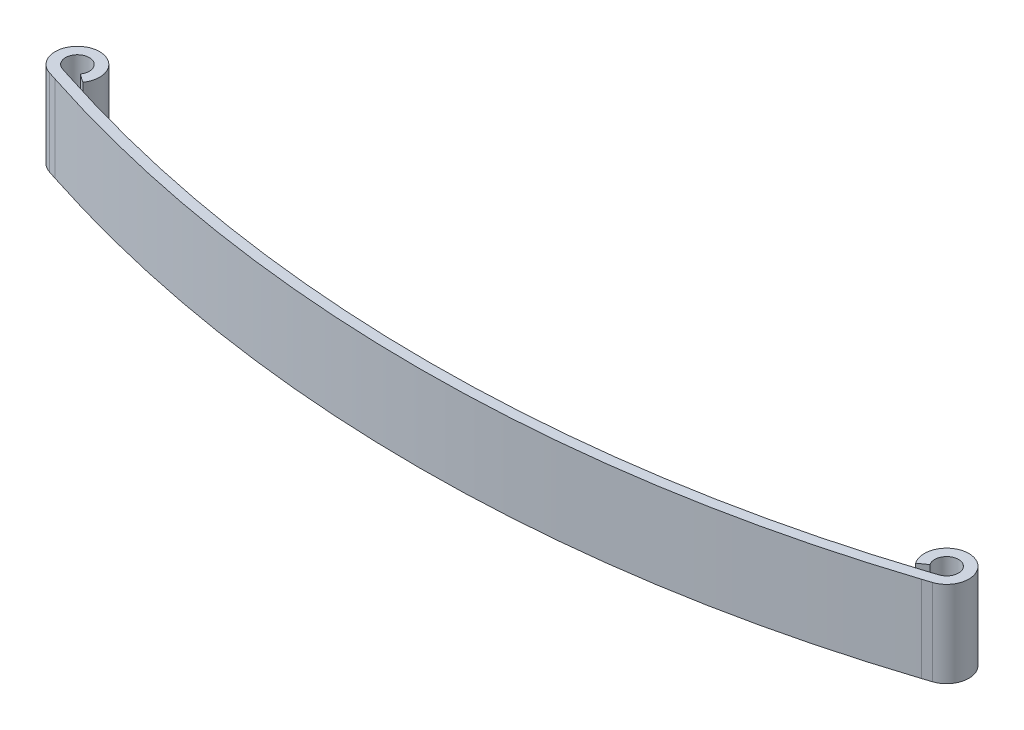
ISO-10303-21;
HEADER;
FILE_DESCRIPTION(('STEP AP214'),'2;1');
FILE_NAME('part.step','',(''),(''),'','','');
FILE_SCHEMA(('AUTOMOTIVE_DESIGN { 1 0 10303 214 1 1 1 1 }'));
ENDSEC;
DATA;
#1=APPLICATION_CONTEXT('core data for automotive mechanical design processes');
#2=APPLICATION_PROTOCOL_DEFINITION('international standard','automotive_design',2000,#1);
#3=PRODUCT_CONTEXT('',#1,'mechanical');
#4=PRODUCT('Part','Part','',(#3));
#5=PRODUCT_RELATED_PRODUCT_CATEGORY('part','',(#4));
#6=PRODUCT_DEFINITION_FORMATION('','',#4);
#7=PRODUCT_DEFINITION_CONTEXT('part definition',#1,'design');
#8=PRODUCT_DEFINITION('design','',#6,#7);
#9=PRODUCT_DEFINITION_SHAPE('','',#8);
#10=(LENGTH_UNIT() NAMED_UNIT(*) SI_UNIT(.MILLI.,.METRE.));
#11=(NAMED_UNIT(*) PLANE_ANGLE_UNIT() SI_UNIT($,.RADIAN.));
#12=(NAMED_UNIT(*) SI_UNIT($,.STERADIAN.) SOLID_ANGLE_UNIT());
#13=UNCERTAINTY_MEASURE_WITH_UNIT(LENGTH_MEASURE(1.E-05),#10,'distance_accuracy_value','');
#14=(GEOMETRIC_REPRESENTATION_CONTEXT(3) GLOBAL_UNCERTAINTY_ASSIGNED_CONTEXT((#13)) GLOBAL_UNIT_ASSIGNED_CONTEXT((#10,
#11,#12)) REPRESENTATION_CONTEXT('',''));
#15=CARTESIAN_POINT('',(0.,0.,0.));
#16=DIRECTION('',(0.,0.,1.));
#17=DIRECTION('',(1.,0.,0.));
#18=AXIS2_PLACEMENT_3D('',#15,#16,#17);
#19=CARTESIAN_POINT('',(221.456257489738,100.,0.));
#20=DIRECTION('',(0.,-1.,0.));
#21=DIRECTION('',(0.,0.,-1.));
#22=AXIS2_PLACEMENT_3D('',#19,#20,#21);
#23=CYLINDRICAL_SURFACE('',#22,1618.48721605359);
#24=CARTESIAN_POINT('',(221.456257489738,0.,0.));
#25=DIRECTION('',(0.,-1.,0.));
#26=DIRECTION('',(0.,0.,1.));
#27=AXIS2_PLACEMENT_3D('',#24,#25,#26);
#28=CIRCLE('',#27,1618.48721605359);
#29=CARTESIAN_POINT('',(721.456257489126,0.,1539.31831293255));
#30=VERTEX_POINT('',#29);
#31=CARTESIAN_POINT('',(-278.54374250966,0.,1539.31831293255));
#32=VERTEX_POINT('',#31);
#33=EDGE_CURVE('E152',#30,#32,#28,.T.);
#34=ORIENTED_EDGE('',*,*,#33,.T.);
#35=DIRECTION('',(0.,-1.,0.));
#36=VECTOR('',#35,1.);
#37=CARTESIAN_POINT('',(-278.54374250966,100.,1539.31831293255));
#38=LINE('',#37,#36);
#39=CARTESIAN_POINT('',(-278.54374250966,100.,1539.31831293255));
#40=VERTEX_POINT('',#39);
#41=EDGE_CURVE('E11',#40,#32,#38,.T.);
#42=ORIENTED_EDGE('',*,*,#41,.F.);
#43=CARTESIAN_POINT('',(221.456257489738,100.,0.));
#44=DIRECTION('',(0.,-1.,0.));
#45=DIRECTION('',(0.,0.,1.));
#46=AXIS2_PLACEMENT_3D('',#43,#44,#45);
#47=CIRCLE('',#46,1618.48721605359);
#48=CARTESIAN_POINT('',(721.456257489126,100.,1539.31831293255));
#49=VERTEX_POINT('',#48);
#50=EDGE_CURVE('E174',#49,#40,#47,.T.);
#51=ORIENTED_EDGE('',*,*,#50,.F.);
#52=DIRECTION('',(0.,-1.,0.));
#53=VECTOR('',#52,1.);
#54=CARTESIAN_POINT('',(721.456257489126,100.,1539.31831293255));
#55=LINE('',#54,#53);
#56=EDGE_CURVE('E148',#49,#30,#55,.T.);
#57=ORIENTED_EDGE('',*,*,#56,.T.);
#58=EDGE_LOOP('',(#34,#42,#51,#57));
#59=FACE_BOUND('',#58,.T.);
#60=ADVANCED_FACE('F32',(#59),#23,.F.);
#61=CARTESIAN_POINT('',(-278.54374250966,100.,1539.31831293255));
#62=DIRECTION('',(-0.308930459900999,0.,0.951084628697866));
#63=DIRECTION('',(0.951084628697866,0.,0.308930459900999));
#64=AXIS2_PLACEMENT_3D('',#61,#62,#63);
#65=PLANE('',#64);
#66=DIRECTION('',(-0.951084628697866,0.,-0.308930459900999));
#67=VECTOR('',#66,1.);
#68=CARTESIAN_POINT('',(-278.54374250966,0.,1539.31831293255));
#69=LINE('',#68,#67);
#70=CARTESIAN_POINT('',(-288.054588797212,0.,1536.22900833335));
#71=VERTEX_POINT('',#70);
#72=EDGE_CURVE('E155',#32,#71,#69,.T.);
#73=ORIENTED_EDGE('',*,*,#72,.T.);
#74=DIRECTION('',(0.,-1.,0.));
#75=VECTOR('',#74,1.);
#76=CARTESIAN_POINT('',(-288.054588797212,100.,1536.22900833335));
#77=LINE('',#76,#75);
#78=CARTESIAN_POINT('',(-288.054588797212,100.,1536.22900833335));
#79=VERTEX_POINT('',#78);
#80=EDGE_CURVE('E40',#79,#71,#77,.T.);
#81=ORIENTED_EDGE('',*,*,#80,.F.);
#82=DIRECTION('',(-0.951084628697866,0.,-0.308930459900999));
#83=VECTOR('',#82,1.);
#84=CARTESIAN_POINT('',(-278.54374250966,100.,1539.31831293255));
#85=LINE('',#84,#83);
#86=EDGE_CURVE('E103',#40,#79,#85,.T.);
#87=ORIENTED_EDGE('',*,*,#86,.F.);
#88=ORIENTED_EDGE('',*,*,#41,.T.);
#89=EDGE_LOOP('',(#73,#81,#87,#88));
#90=FACE_BOUND('',#89,.T.);
#91=ADVANCED_FACE('F252',(#90),#65,.F.);
#92=CARTESIAN_POINT('',(-283.784944200392,100.,1523.08432409909));
#93=DIRECTION('',(0.,-1.,0.));
#94=DIRECTION('',(0.,0.,-1.));
#95=AXIS2_PLACEMENT_3D('',#92,#93,#94);
#96=CYLINDRICAL_SURFACE('',#95,13.8207303932043);
#97=CARTESIAN_POINT('',(-283.784944200392,0.,1523.08432409909));
#98=DIRECTION('',(0.,-1.,0.));
#99=DIRECTION('',(0.,0.,-1.));
#100=AXIS2_PLACEMENT_3D('',#97,#98,#99);
#101=CIRCLE('',#100,13.8207303932043);
#102=CARTESIAN_POINT('',(-272.487055111111,0.,1531.04486998036));
#103=VERTEX_POINT('',#102);
#104=EDGE_CURVE('E157',#71,#103,#101,.T.);
#105=ORIENTED_EDGE('',*,*,#104,.T.);
#106=DIRECTION('',(0.,-1.,0.));
#107=VECTOR('',#106,1.);
#108=CARTESIAN_POINT('',(-272.487055111111,100.,1531.04486998036));
#109=LINE('',#108,#107);
#110=CARTESIAN_POINT('',(-272.487055111111,100.,1531.04486998036));
#111=VERTEX_POINT('',#110);
#112=EDGE_CURVE('E193',#111,#103,#109,.T.);
#113=ORIENTED_EDGE('',*,*,#112,.F.);
#114=CARTESIAN_POINT('',(-283.784944200392,100.,1523.08432409909));
#115=DIRECTION('',(0.,-1.,0.));
#116=DIRECTION('',(0.,0.,-1.));
#117=AXIS2_PLACEMENT_3D('',#114,#115,#116);
#118=CIRCLE('',#117,13.8207303932043);
#119=EDGE_CURVE('E201',#79,#111,#118,.T.);
#120=ORIENTED_EDGE('',*,*,#119,.F.);
#121=ORIENTED_EDGE('',*,*,#80,.T.);
#122=EDGE_LOOP('',(#105,#113,#120,#121));
#123=FACE_BOUND('',#122,.T.);
#124=ADVANCED_FACE('F199',(#123),#96,.F.);
#125=CARTESIAN_POINT('',(-272.487055111111,100.,1531.04486998036));
#126=DIRECTION('',(0.575985903407235,0.,-0.817459625349259));
#127=DIRECTION('',(-0.817459625349259,0.,-0.575985903407235));
#128=AXIS2_PLACEMENT_3D('',#125,#126,#127);
#129=PLANE('',#128);
#130=DIRECTION('',(0.817459625349259,0.,0.575985903407235));
#131=VECTOR('',#130,1.);
#132=CARTESIAN_POINT('',(-272.487055111111,0.,1531.04486998036));
#133=LINE('',#132,#131);
#134=CARTESIAN_POINT('',(-262.677539606919,0.,1537.95670082125));
#135=VERTEX_POINT('',#134);
#136=EDGE_CURVE('E159',#103,#135,#133,.T.);
#137=ORIENTED_EDGE('',*,*,#136,.T.);
#138=DIRECTION('',(0.,-1.,0.));
#139=VECTOR('',#138,1.);
#140=CARTESIAN_POINT('',(-262.677539606919,100.,1537.95670082125));
#141=LINE('',#140,#139);
#142=CARTESIAN_POINT('',(-262.677539606919,100.,1537.95670082125));
#143=VERTEX_POINT('',#142);
#144=EDGE_CURVE('E190',#143,#135,#141,.T.);
#145=ORIENTED_EDGE('',*,*,#144,.F.);
#146=DIRECTION('',(0.817459625349259,0.,0.575985903407235));
#147=VECTOR('',#146,1.);
#148=CARTESIAN_POINT('',(-272.487055111111,100.,1531.04486998036));
#149=LINE('',#148,#147);
#150=EDGE_CURVE('E219',#111,#143,#149,.T.);
#151=ORIENTED_EDGE('',*,*,#150,.F.);
#152=ORIENTED_EDGE('',*,*,#112,.T.);
#153=EDGE_LOOP('',(#137,#145,#151,#152));
#154=FACE_BOUND('',#153,.T.);
#155=ADVANCED_FACE('F210',(#154),#129,.F.);
#156=CARTESIAN_POINT('',(-283.784944200392,100.,1523.08432409909));
#157=DIRECTION('',(0.,-1.,0.));
#158=DIRECTION('',(0.,0.,-1.));
#159=AXIS2_PLACEMENT_3D('',#156,#157,#158);
#160=CYLINDRICAL_SURFACE('',#159,25.8207303932044);
#161=CARTESIAN_POINT('',(-283.784944200392,0.,1523.08432409909));
#162=DIRECTION('',(0.,1.,0.));
#163=DIRECTION('',(0.,0.,-1.));
#164=AXIS2_PLACEMENT_3D('',#161,#162,#163);
#165=CIRCLE('',#164,25.8207303932044);
#166=CARTESIAN_POINT('',(-291.761754316031,0.,1547.64202387772));
#167=VERTEX_POINT('',#166);
#168=EDGE_CURVE('E161',#135,#167,#165,.T.);
#169=ORIENTED_EDGE('',*,*,#168,.T.);
#170=DIRECTION('',(0.,-1.,0.));
#171=VECTOR('',#170,1.);
#172=CARTESIAN_POINT('',(-291.761754316031,100.,1547.64202387772));
#173=LINE('',#172,#171);
#174=CARTESIAN_POINT('',(-291.761754316031,100.,1547.64202387772));
#175=VERTEX_POINT('',#174);
#176=EDGE_CURVE('E187',#175,#167,#173,.T.);
#177=ORIENTED_EDGE('',*,*,#176,.F.);
#178=CARTESIAN_POINT('',(-283.784944200392,100.,1523.08432409909));
#179=DIRECTION('',(0.,1.,0.));
#180=DIRECTION('',(0.,0.,-1.));
#181=AXIS2_PLACEMENT_3D('',#178,#179,#180);
#182=CIRCLE('',#181,25.8207303932044);
#183=EDGE_CURVE('E216',#143,#175,#182,.T.);
#184=ORIENTED_EDGE('',*,*,#183,.F.);
#185=ORIENTED_EDGE('',*,*,#144,.T.);
#186=EDGE_LOOP('',(#169,#177,#184,#185));
#187=FACE_BOUND('',#186,.T.);
#188=ADVANCED_FACE('F214',(#187),#160,.T.);
#189=CARTESIAN_POINT('',(-282.250908028406,100.,1550.73132847694));
#190=DIRECTION('',(0.30893045990107,0.,-0.951084628697842));
#191=DIRECTION('',(-0.951084628697843,0.,-0.30893045990107));
#192=AXIS2_PLACEMENT_3D('',#189,#190,#191);
#193=PLANE('',#192);
#194=DIRECTION('',(0.951084628697842,0.,0.30893045990107));
#195=VECTOR('',#194,1.);
#196=CARTESIAN_POINT('',(-282.250908028406,0.,1550.73132847694));
#197=LINE('',#196,#195);
#198=CARTESIAN_POINT('',(-282.250908028406,0.,1550.73132847694));
#199=VERTEX_POINT('',#198);
#200=EDGE_CURVE('E163',#167,#199,#197,.T.);
#201=ORIENTED_EDGE('',*,*,#200,.T.);
#202=DIRECTION('',(0.,-1.,0.));
#203=VECTOR('',#202,1.);
#204=CARTESIAN_POINT('',(-282.250908028406,100.,1550.73132847694));
#205=LINE('',#204,#203);
#206=CARTESIAN_POINT('',(-282.250908028406,100.,1550.73132847694));
#207=VERTEX_POINT('',#206);
#208=EDGE_CURVE('E184',#207,#199,#205,.T.);
#209=ORIENTED_EDGE('',*,*,#208,.F.);
#210=DIRECTION('',(0.951084628697842,0.,0.30893045990107));
#211=VECTOR('',#210,1.);
#212=CARTESIAN_POINT('',(-282.250908028406,100.,1550.73132847694));
#213=LINE('',#212,#211);
#214=EDGE_CURVE('E218',#175,#207,#213,.T.);
#215=ORIENTED_EDGE('',*,*,#214,.F.);
#216=ORIENTED_EDGE('',*,*,#176,.T.);
#217=EDGE_LOOP('',(#201,#209,#215,#216));
#218=FACE_BOUND('',#217,.T.);
#219=ADVANCED_FACE('F265',(#218),#193,.F.);
#220=CARTESIAN_POINT('',(221.456257489738,100.,0.));
#221=DIRECTION('',(0.,-1.,0.));
#222=DIRECTION('',(0.,0.,-1.));
#223=AXIS2_PLACEMENT_3D('',#220,#221,#222);
#224=CYLINDRICAL_SURFACE('',#223,1630.48721605359);
#225=CARTESIAN_POINT('',(221.456257489738,0.,0.));
#226=DIRECTION('',(0.,1.,0.));
#227=DIRECTION('',(0.,0.,1.));
#228=AXIS2_PLACEMENT_3D('',#225,#226,#227);
#229=CIRCLE('',#228,1630.48721605359);
#230=CARTESIAN_POINT('',(725.163423007932,0.,1550.73132847693));
#231=VERTEX_POINT('',#230);
#232=EDGE_CURVE('E165',#199,#231,#229,.T.);
#233=ORIENTED_EDGE('',*,*,#232,.T.);
#234=DIRECTION('',(0.,-1.,0.));
#235=VECTOR('',#234,1.);
#236=CARTESIAN_POINT('',(725.163423007932,100.,1550.73132847693));
#237=LINE('',#236,#235);
#238=CARTESIAN_POINT('',(725.163423007932,100.,1550.73132847693));
#239=VERTEX_POINT('',#238);
#240=EDGE_CURVE('E181',#239,#231,#237,.T.);
#241=ORIENTED_EDGE('',*,*,#240,.F.);
#242=CARTESIAN_POINT('',(221.456257489738,100.,0.));
#243=DIRECTION('',(0.,1.,0.));
#244=DIRECTION('',(0.,0.,1.));
#245=AXIS2_PLACEMENT_3D('',#242,#243,#244);
#246=CIRCLE('',#245,1630.48721605359);
#247=EDGE_CURVE('E221',#207,#239,#246,.T.);
#248=ORIENTED_EDGE('',*,*,#247,.F.);
#249=ORIENTED_EDGE('',*,*,#208,.T.);
#250=EDGE_LOOP('',(#233,#241,#248,#249));
#251=FACE_BOUND('',#250,.T.);
#252=ADVANCED_FACE('F268',(#251),#224,.T.);
#253=CARTESIAN_POINT('',(725.163423007932,100.,1550.73132847693));
#254=DIRECTION('',(-0.308930459901044,0.,-0.951084628697851));
#255=DIRECTION('',(-0.951084628697851,0.,0.308930459901044));
#256=AXIS2_PLACEMENT_3D('',#253,#254,#255);
#257=PLANE('',#256);
#258=DIRECTION('',(0.951084628697851,0.,-0.308930459901044));
#259=VECTOR('',#258,1.);
#260=CARTESIAN_POINT('',(725.163423007932,0.,1550.73132847693));
#261=LINE('',#260,#259);
#262=CARTESIAN_POINT('',(734.674269295507,0.,1547.64202387772));
#263=VERTEX_POINT('',#262);
#264=EDGE_CURVE('E167',#231,#263,#261,.T.);
#265=ORIENTED_EDGE('',*,*,#264,.T.);
#266=DIRECTION('',(0.,-1.,0.));
#267=VECTOR('',#266,1.);
#268=CARTESIAN_POINT('',(734.674269295507,100.,1547.64202387772));
#269=LINE('',#268,#267);
#270=CARTESIAN_POINT('',(734.674269295507,100.,1547.64202387772));
#271=VERTEX_POINT('',#270);
#272=EDGE_CURVE('E178',#271,#263,#269,.T.);
#273=ORIENTED_EDGE('',*,*,#272,.F.);
#274=DIRECTION('',(0.951084628697851,0.,-0.308930459901044));
#275=VECTOR('',#274,1.);
#276=CARTESIAN_POINT('',(725.163423007932,100.,1550.73132847693));
#277=LINE('',#276,#275);
#278=EDGE_CURVE('E227',#239,#271,#277,.T.);
#279=ORIENTED_EDGE('',*,*,#278,.F.);
#280=ORIENTED_EDGE('',*,*,#240,.T.);
#281=EDGE_LOOP('',(#265,#273,#279,#280));
#282=FACE_BOUND('',#281,.T.);
#283=ADVANCED_FACE('F233',(#282),#257,.F.);
#284=CARTESIAN_POINT('',(726.697459179868,100.,1523.08432409909));
#285=DIRECTION('',(0.,-1.,0.));
#286=DIRECTION('',(0.,0.,-1.));
#287=AXIS2_PLACEMENT_3D('',#284,#285,#286);
#288=CYLINDRICAL_SURFACE('',#287,25.8207303932045);
#289=CARTESIAN_POINT('',(726.697459179868,0.,1523.08432409909));
#290=DIRECTION('',(0.,1.,0.));
#291=DIRECTION('',(0.,0.,1.));
#292=AXIS2_PLACEMENT_3D('',#289,#290,#291);
#293=CIRCLE('',#292,25.8207303932045);
#294=CARTESIAN_POINT('',(705.590054586395,0.,1537.95670082125));
#295=VERTEX_POINT('',#294);
#296=EDGE_CURVE('E169',#263,#295,#293,.T.);
#297=ORIENTED_EDGE('',*,*,#296,.T.);
#298=DIRECTION('',(0.,-1.,0.));
#299=VECTOR('',#298,1.);
#300=CARTESIAN_POINT('',(705.590054586395,100.,1537.95670082125));
#301=LINE('',#300,#299);
#302=CARTESIAN_POINT('',(705.590054586395,100.,1537.95670082125));
#303=VERTEX_POINT('',#302);
#304=EDGE_CURVE('E143',#303,#295,#301,.T.);
#305=ORIENTED_EDGE('',*,*,#304,.F.);
#306=CARTESIAN_POINT('',(726.697459179868,100.,1523.08432409909));
#307=DIRECTION('',(0.,1.,0.));
#308=DIRECTION('',(0.,0.,1.));
#309=AXIS2_PLACEMENT_3D('',#306,#307,#308);
#310=CIRCLE('',#309,25.8207303932045);
#311=EDGE_CURVE('E134',#271,#303,#310,.T.);
#312=ORIENTED_EDGE('',*,*,#311,.F.);
#313=ORIENTED_EDGE('',*,*,#272,.T.);
#314=EDGE_LOOP('',(#297,#305,#312,#313));
#315=FACE_BOUND('',#314,.T.);
#316=ADVANCED_FACE('F237',(#315),#288,.T.);
#317=CARTESIAN_POINT('',(715.399570090587,100.,1531.04486998036));
#318=DIRECTION('',(-0.575985903407231,0.,-0.817459625349262));
#319=DIRECTION('',(-0.817459625349263,0.,0.575985903407231));
#320=AXIS2_PLACEMENT_3D('',#317,#318,#319);
#321=PLANE('',#320);
#322=DIRECTION('',(0.817459625349262,0.,-0.575985903407231));
#323=VECTOR('',#322,1.);
#324=CARTESIAN_POINT('',(715.399570090587,0.,1531.04486998036));
#325=LINE('',#324,#323);
#326=CARTESIAN_POINT('',(715.399570090587,0.,1531.04486998036));
#327=VERTEX_POINT('',#326);
#328=EDGE_CURVE('E142',#295,#327,#325,.T.);
#329=ORIENTED_EDGE('',*,*,#328,.T.);
#330=DIRECTION('',(0.,-1.,0.));
#331=VECTOR('',#330,1.);
#332=CARTESIAN_POINT('',(715.399570090587,100.,1531.04486998036));
#333=LINE('',#332,#331);
#334=CARTESIAN_POINT('',(715.399570090587,100.,1531.04486998036));
#335=VERTEX_POINT('',#334);
#336=EDGE_CURVE('E139',#335,#327,#333,.T.);
#337=ORIENTED_EDGE('',*,*,#336,.F.);
#338=DIRECTION('',(0.817459625349262,0.,-0.575985903407231));
#339=VECTOR('',#338,1.);
#340=CARTESIAN_POINT('',(715.399570090587,100.,1531.04486998036));
#341=LINE('',#340,#339);
#342=EDGE_CURVE('E128',#303,#335,#341,.T.);
#343=ORIENTED_EDGE('',*,*,#342,.F.);
#344=ORIENTED_EDGE('',*,*,#304,.T.);
#345=EDGE_LOOP('',(#329,#337,#343,#344));
#346=FACE_BOUND('',#345,.T.);
#347=ADVANCED_FACE('F140',(#346),#321,.F.);
#348=CARTESIAN_POINT('',(726.697459179868,100.,1523.08432409909));
#349=DIRECTION('',(0.,-1.,0.));
#350=DIRECTION('',(0.,0.,-1.));
#351=AXIS2_PLACEMENT_3D('',#348,#349,#350);
#352=CYLINDRICAL_SURFACE('',#351,13.8207303932043);
#353=CARTESIAN_POINT('',(726.697459179868,0.,1523.08432409909));
#354=DIRECTION('',(0.,-1.,0.));
#355=DIRECTION('',(0.,0.,1.));
#356=AXIS2_PLACEMENT_3D('',#353,#354,#355);
#357=CIRCLE('',#356,13.8207303932043);
#358=CARTESIAN_POINT('',(730.96710377672,0.,1536.22900833334));
#359=VERTEX_POINT('',#358);
#360=EDGE_CURVE('E89',#327,#359,#357,.T.);
#361=ORIENTED_EDGE('',*,*,#360,.T.);
#362=DIRECTION('',(0.,-1.,0.));
#363=VECTOR('',#362,1.);
#364=CARTESIAN_POINT('',(730.96710377672,100.,1536.22900833334));
#365=LINE('',#364,#363);
#366=CARTESIAN_POINT('',(730.96710377672,100.,1536.22900833334));
#367=VERTEX_POINT('',#366);
#368=EDGE_CURVE('E144',#367,#359,#365,.T.);
#369=ORIENTED_EDGE('',*,*,#368,.F.);
#370=CARTESIAN_POINT('',(726.697459179868,100.,1523.08432409909));
#371=DIRECTION('',(0.,-1.,0.));
#372=DIRECTION('',(0.,0.,1.));
#373=AXIS2_PLACEMENT_3D('',#370,#371,#372);
#374=CIRCLE('',#373,13.8207303932043);
#375=EDGE_CURVE('E132',#335,#367,#374,.T.);
#376=ORIENTED_EDGE('',*,*,#375,.F.);
#377=ORIENTED_EDGE('',*,*,#336,.T.);
#378=EDGE_LOOP('',(#361,#369,#376,#377));
#379=FACE_BOUND('',#378,.T.);
#380=ADVANCED_FACE('F146',(#379),#352,.F.);
#381=CARTESIAN_POINT('',(721.456257489126,100.,1539.31831293255));
#382=DIRECTION('',(0.308930459901045,0.,0.951084628697851));
#383=DIRECTION('',(0.951084628697851,0.,-0.308930459901045));
#384=AXIS2_PLACEMENT_3D('',#381,#382,#383);
#385=PLANE('',#384);
#386=DIRECTION('',(-0.951084628697851,0.,0.308930459901045));
#387=VECTOR('',#386,1.);
#388=CARTESIAN_POINT('',(721.456257489126,0.,1539.31831293255));
#389=LINE('',#388,#387);
#390=EDGE_CURVE('E95',#359,#30,#389,.T.);
#391=ORIENTED_EDGE('',*,*,#390,.T.);
#392=ORIENTED_EDGE('',*,*,#56,.F.);
#393=DIRECTION('',(-0.951084628697851,0.,0.308930459901045));
#394=VECTOR('',#393,1.);
#395=CARTESIAN_POINT('',(721.456257489126,100.,1539.31831293255));
#396=LINE('',#395,#394);
#397=EDGE_CURVE('E48',#367,#49,#396,.T.);
#398=ORIENTED_EDGE('',*,*,#397,.F.);
#399=ORIENTED_EDGE('',*,*,#368,.T.);
#400=EDGE_LOOP('',(#391,#392,#398,#399));
#401=FACE_BOUND('',#400,.T.);
#402=ADVANCED_FACE('F241',(#401),#385,.F.);
#403=CARTESIAN_POINT('',(221.456257489738,100.,0.));
#404=DIRECTION('',(0.,1.,0.));
#405=DIRECTION('',(0.,0.,1.));
#406=AXIS2_PLACEMENT_3D('',#403,#404,#405);
#407=PLANE('',#406);
#408=ORIENTED_EDGE('',*,*,#50,.T.);
#409=ORIENTED_EDGE('',*,*,#86,.T.);
#410=ORIENTED_EDGE('',*,*,#119,.T.);
#411=ORIENTED_EDGE('',*,*,#150,.T.);
#412=ORIENTED_EDGE('',*,*,#183,.T.);
#413=ORIENTED_EDGE('',*,*,#214,.T.);
#414=ORIENTED_EDGE('',*,*,#247,.T.);
#415=ORIENTED_EDGE('',*,*,#278,.T.);
#416=ORIENTED_EDGE('',*,*,#311,.T.);
#417=ORIENTED_EDGE('',*,*,#342,.T.);
#418=ORIENTED_EDGE('',*,*,#375,.T.);
#419=ORIENTED_EDGE('',*,*,#397,.T.);
#420=EDGE_LOOP('',(#408,#409,#410,#411,#412,#413,#414,#415,#416,#417,#418,#419));
#421=FACE_BOUND('',#420,.T.);
#422=ADVANCED_FACE('F130',(#421),#407,.T.);
#423=CARTESIAN_POINT('',(221.456257489738,0.,0.));
#424=DIRECTION('',(0.,1.,0.));
#425=DIRECTION('',(0.,0.,1.));
#426=AXIS2_PLACEMENT_3D('',#423,#424,#425);
#427=PLANE('',#426);
#428=ORIENTED_EDGE('',*,*,#33,.F.);
#429=ORIENTED_EDGE('',*,*,#390,.F.);
#430=ORIENTED_EDGE('',*,*,#360,.F.);
#431=ORIENTED_EDGE('',*,*,#328,.F.);
#432=ORIENTED_EDGE('',*,*,#296,.F.);
#433=ORIENTED_EDGE('',*,*,#264,.F.);
#434=ORIENTED_EDGE('',*,*,#232,.F.);
#435=ORIENTED_EDGE('',*,*,#200,.F.);
#436=ORIENTED_EDGE('',*,*,#168,.F.);
#437=ORIENTED_EDGE('',*,*,#136,.F.);
#438=ORIENTED_EDGE('',*,*,#104,.F.);
#439=ORIENTED_EDGE('',*,*,#72,.F.);
#440=EDGE_LOOP('',(#428,#429,#430,#431,#432,#433,#434,#435,#436,#437,#438,#439));
#441=FACE_BOUND('',#440,.T.);
#442=ADVANCED_FACE('F205',(#441),#427,.F.);
#443=CLOSED_SHELL('',(#60,#91,#124,#155,#188,#219,#252,#283,#316,#347,#380,#402,#422,#442));
#444=MANIFOLD_SOLID_BREP('B2',#443);
#445=ADVANCED_BREP_SHAPE_REPRESENTATION('',(#18,#444),#14);
#446=SHAPE_DEFINITION_REPRESENTATION(#9,#445);
ENDSEC;
END-ISO-10303-21;
